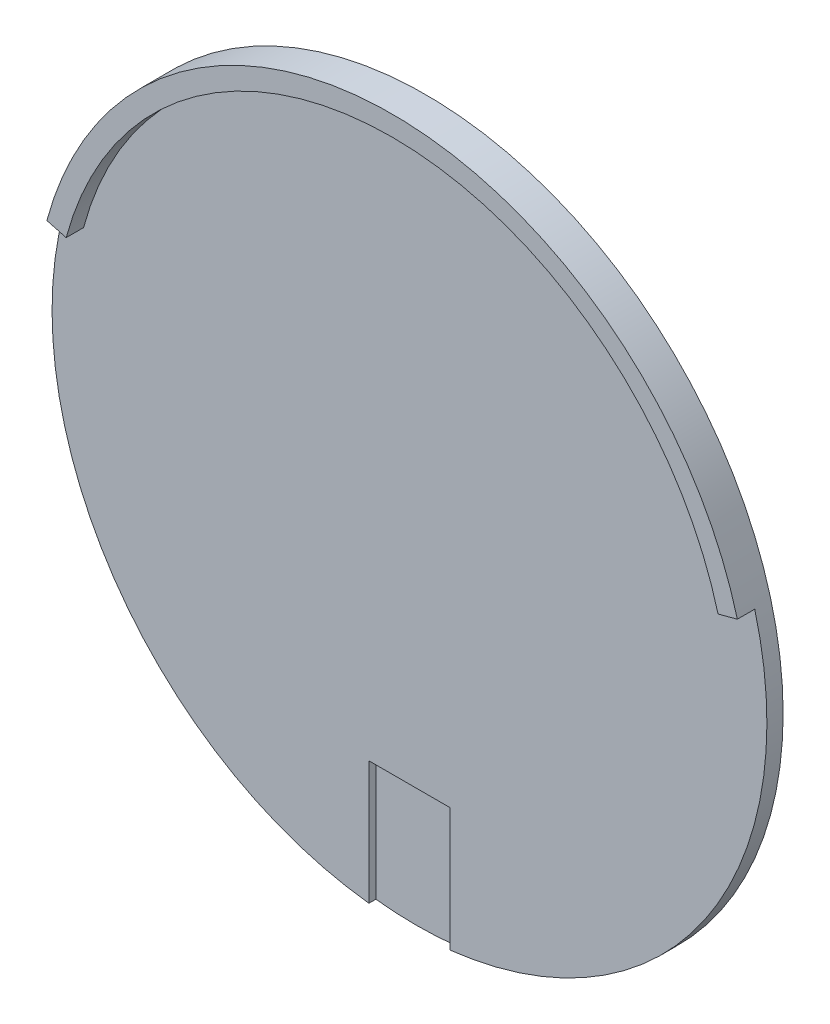
ISO-10303-21;
HEADER;
FILE_DESCRIPTION(('STEP AP214'),'2;1');
FILE_NAME('part.step','',(''),(''),'','','');
FILE_SCHEMA(('AUTOMOTIVE_DESIGN { 1 0 10303 214 1 1 1 1 }'));
ENDSEC;
DATA;
#1=APPLICATION_CONTEXT('core data for automotive mechanical design processes');
#2=APPLICATION_PROTOCOL_DEFINITION('international standard','automotive_design',2000,#1);
#3=PRODUCT_CONTEXT('',#1,'mechanical');
#4=PRODUCT('Part','Part','',(#3));
#5=PRODUCT_RELATED_PRODUCT_CATEGORY('part','',(#4));
#6=PRODUCT_DEFINITION_FORMATION('','',#4);
#7=PRODUCT_DEFINITION_CONTEXT('part definition',#1,'design');
#8=PRODUCT_DEFINITION('design','',#6,#7);
#9=PRODUCT_DEFINITION_SHAPE('','',#8);
#10=(LENGTH_UNIT() NAMED_UNIT(*) SI_UNIT(.MILLI.,.METRE.));
#11=(NAMED_UNIT(*) PLANE_ANGLE_UNIT() SI_UNIT($,.RADIAN.));
#12=(NAMED_UNIT(*) SI_UNIT($,.STERADIAN.) SOLID_ANGLE_UNIT());
#13=UNCERTAINTY_MEASURE_WITH_UNIT(LENGTH_MEASURE(1.E-05),#10,'distance_accuracy_value','');
#14=(GEOMETRIC_REPRESENTATION_CONTEXT(3) GLOBAL_UNCERTAINTY_ASSIGNED_CONTEXT((#13)) GLOBAL_UNIT_ASSIGNED_CONTEXT((#10,
#11,#12)) REPRESENTATION_CONTEXT('',''));
#15=CARTESIAN_POINT('',(0.,0.,0.));
#16=DIRECTION('',(0.,0.,1.));
#17=DIRECTION('',(1.,0.,0.));
#18=AXIS2_PLACEMENT_3D('',#15,#16,#17);
#19=CARTESIAN_POINT('',(70.,0.,74.8));
#20=DIRECTION('',(0.,0.,-1.));
#21=DIRECTION('',(-1.,0.,0.));
#22=AXIS2_PLACEMENT_3D('',#19,#20,#21);
#23=CYLINDRICAL_SURFACE('',#22,61.7);
#24=CARTESIAN_POINT('',(70.,0.,73.6));
#25=DIRECTION('',(0.,0.,1.));
#26=DIRECTION('',(1.,0.,0.));
#27=AXIS2_PLACEMENT_3D('',#24,#25,#26);
#28=CIRCLE('',#27,61.7);
#29=CARTESIAN_POINT('',(63.,-61.3016312996645,73.6));
#30=VERTEX_POINT('',#29);
#31=CARTESIAN_POINT('',(77.,-61.3016312996645,73.6));
#32=VERTEX_POINT('',#31);
#33=EDGE_CURVE('E11',#30,#32,#28,.T.);
#34=ORIENTED_EDGE('',*,*,#33,.F.);
#35=DIRECTION('',(0.,0.,-1.));
#36=VECTOR('',#35,1.);
#37=CARTESIAN_POINT('',(63.,-61.3016312996645,74.8));
#38=LINE('',#37,#36);
#39=CARTESIAN_POINT('',(63.,-61.3016312996645,74.8));
#40=VERTEX_POINT('',#39);
#41=EDGE_CURVE('E134',#30,#40,#38,.F.);
#42=ORIENTED_EDGE('',*,*,#41,.T.);
#43=CARTESIAN_POINT('',(70.,0.,74.8));
#44=DIRECTION('',(0.,0.,1.));
#45=DIRECTION('',(1.,0.,0.));
#46=AXIS2_PLACEMENT_3D('',#43,#44,#45);
#47=CIRCLE('',#46,61.7);
#48=CARTESIAN_POINT('',(10.4023765179645,15.9691350828255,74.8));
#49=VERTEX_POINT('',#48);
#50=EDGE_CURVE('E163',#49,#40,#47,.T.);
#51=ORIENTED_EDGE('',*,*,#50,.F.);
#52=DIRECTION('',(0.,0.,-1.));
#53=VECTOR('',#52,1.);
#54=CARTESIAN_POINT('',(10.4023765179645,15.9691350828255,77.8));
#55=LINE('',#54,#53);
#56=CARTESIAN_POINT('',(10.4023765179645,15.9691350828255,77.8));
#57=VERTEX_POINT('',#56);
#58=EDGE_CURVE('E152',#57,#49,#55,.T.);
#59=ORIENTED_EDGE('',*,*,#58,.F.);
#60=CARTESIAN_POINT('',(70.,0.,77.8));
#61=DIRECTION('',(0.,0.,1.));
#62=DIRECTION('',(1.,0.,0.));
#63=AXIS2_PLACEMENT_3D('',#60,#61,#62);
#64=CIRCLE('',#63,61.7);
#65=CARTESIAN_POINT('',(129.597623482036,15.9691350828255,77.8));
#66=VERTEX_POINT('',#65);
#67=EDGE_CURVE('E142',#66,#57,#64,.T.);
#68=ORIENTED_EDGE('',*,*,#67,.F.);
#69=DIRECTION('',(0.,0.,-1.));
#70=VECTOR('',#69,1.);
#71=CARTESIAN_POINT('',(129.597623482036,15.9691350828255,77.8));
#72=LINE('',#71,#70);
#73=CARTESIAN_POINT('',(129.597623482036,15.9691350828255,74.8));
#74=VERTEX_POINT('',#73);
#75=EDGE_CURVE('E160',#66,#74,#72,.T.);
#76=ORIENTED_EDGE('',*,*,#75,.T.);
#77=CARTESIAN_POINT('',(77.,-61.3016312996645,74.8));
#78=VERTEX_POINT('',#77);
#79=EDGE_CURVE('E170',#78,#74,#47,.T.);
#80=ORIENTED_EDGE('',*,*,#79,.F.);
#81=DIRECTION('',(0.,0.,-1.));
#82=VECTOR('',#81,1.);
#83=CARTESIAN_POINT('',(77.,-61.3016312996645,74.8));
#84=LINE('',#83,#82);
#85=EDGE_CURVE('E56',#78,#32,#84,.T.);
#86=ORIENTED_EDGE('',*,*,#85,.T.);
#87=EDGE_LOOP('',(#34,#42,#51,#59,#68,#76,#80,#86));
#88=FACE_BOUND('',#87,.T.);
#89=CARTESIAN_POINT('',(70.,0.,72.));
#90=DIRECTION('',(0.,0.,1.));
#91=DIRECTION('',(1.,0.,0.));
#92=AXIS2_PLACEMENT_3D('',#89,#90,#91);
#93=CIRCLE('',#92,61.7);
#94=CARTESIAN_POINT('',(131.7,0.,72.));
#95=VERTEX_POINT('',#94);
#96=EDGE_CURVE('E162',#95,#95,#93,.T.);
#97=ORIENTED_EDGE('',*,*,#96,.T.);
#98=EDGE_LOOP('',(#97));
#99=FACE_BOUND('',#98,.T.);
#100=ADVANCED_FACE('F43',(#88,#99),#23,.T.);
#101=CARTESIAN_POINT('',(70.,0.,74.8));
#102=DIRECTION('',(0.,0.,1.));
#103=DIRECTION('',(1.,0.,0.));
#104=AXIS2_PLACEMENT_3D('',#101,#102,#103);
#105=PLANE('',#104);
#106=DIRECTION('',(0.,-1.,0.));
#107=VECTOR('',#106,1.);
#108=CARTESIAN_POINT('',(63.,0.,74.8));
#109=LINE('',#108,#107);
#110=CARTESIAN_POINT('',(63.,-40.,74.8));
#111=VERTEX_POINT('',#110);
#112=EDGE_CURVE('E51',#111,#40,#109,.T.);
#113=ORIENTED_EDGE('',*,*,#112,.F.);
#114=DIRECTION('',(-1.,0.,0.));
#115=VECTOR('',#114,1.);
#116=CARTESIAN_POINT('',(70.,-40.,74.8));
#117=LINE('',#116,#115);
#118=CARTESIAN_POINT('',(77.,-40.,74.8));
#119=VERTEX_POINT('',#118);
#120=EDGE_CURVE('E172',#119,#111,#117,.T.);
#121=ORIENTED_EDGE('',*,*,#120,.F.);
#122=DIRECTION('',(0.,1.,0.));
#123=VECTOR('',#122,1.);
#124=CARTESIAN_POINT('',(77.,0.,74.8));
#125=LINE('',#124,#123);
#126=EDGE_CURVE('E118',#78,#119,#125,.T.);
#127=ORIENTED_EDGE('',*,*,#126,.F.);
#128=ORIENTED_EDGE('',*,*,#79,.T.);
#129=DIRECTION('',(0.965925826289068,0.258819045102522,0.));
#130=VECTOR('',#129,1.);
#131=CARTESIAN_POINT('',(126.265179381338,15.0762093772218,74.8));
#132=LINE('',#131,#130);
#133=CARTESIAN_POINT('',(126.265179381338,15.0762093772218,74.8));
#134=VERTEX_POINT('',#133);
#135=EDGE_CURVE('E146',#134,#74,#132,.T.);
#136=ORIENTED_EDGE('',*,*,#135,.F.);
#137=CARTESIAN_POINT('',(70.,0.,74.8));
#138=DIRECTION('',(0.,0.,-1.));
#139=DIRECTION('',(-1.,0.,0.));
#140=AXIS2_PLACEMENT_3D('',#137,#138,#139);
#141=CIRCLE('',#140,58.25);
#142=CARTESIAN_POINT('',(13.7348206186618,15.0762093772218,74.8));
#143=VERTEX_POINT('',#142);
#144=EDGE_CURVE('E67',#143,#134,#141,.T.);
#145=ORIENTED_EDGE('',*,*,#144,.F.);
#146=DIRECTION('',(0.965925826289068,-0.258819045102521,0.));
#147=VECTOR('',#146,1.);
#148=CARTESIAN_POINT('',(10.4023765179645,15.9691350828255,74.8));
#149=LINE('',#148,#147);
#150=EDGE_CURVE('E140',#49,#143,#149,.T.);
#151=ORIENTED_EDGE('',*,*,#150,.F.);
#152=ORIENTED_EDGE('',*,*,#50,.T.);
#153=EDGE_LOOP('',(#113,#121,#127,#128,#136,#145,#151,#152));
#154=FACE_BOUND('',#153,.T.);
#155=ADVANCED_FACE('F206',(#154),#105,.T.);
#156=CARTESIAN_POINT('',(70.,0.,72.));
#157=DIRECTION('',(0.,0.,1.));
#158=DIRECTION('',(1.,0.,0.));
#159=AXIS2_PLACEMENT_3D('',#156,#157,#158);
#160=PLANE('',#159);
#161=CARTESIAN_POINT('',(70.,50.,72.));
#162=DIRECTION('',(0.,0.,1.));
#163=DIRECTION('',(1.,0.,0.));
#164=AXIS2_PLACEMENT_3D('',#161,#162,#163);
#165=CIRCLE('',#164,1.);
#166=CARTESIAN_POINT('',(71.,50.,72.));
#167=VERTEX_POINT('',#166);
#168=EDGE_CURVE('E46',#167,#167,#165,.T.);
#169=ORIENTED_EDGE('',*,*,#168,.T.);
#170=EDGE_LOOP('',(#169));
#171=FACE_BOUND('',#170,.T.);
#172=CARTESIAN_POINT('',(26.6987298107781,-25.,72.));
#173=DIRECTION('',(0.,0.,1.));
#174=DIRECTION('',(1.,0.,0.));
#175=AXIS2_PLACEMENT_3D('',#172,#173,#174);
#176=CIRCLE('',#175,1.);
#177=CARTESIAN_POINT('',(27.6987298107781,-25.,72.));
#178=VERTEX_POINT('',#177);
#179=EDGE_CURVE('E176',#178,#178,#176,.T.);
#180=ORIENTED_EDGE('',*,*,#179,.T.);
#181=EDGE_LOOP('',(#180));
#182=FACE_BOUND('',#181,.T.);
#183=CARTESIAN_POINT('',(113.301270189222,-25.,72.));
#184=DIRECTION('',(0.,0.,1.));
#185=DIRECTION('',(1.,0.,0.));
#186=AXIS2_PLACEMENT_3D('',#183,#184,#185);
#187=CIRCLE('',#186,1.);
#188=CARTESIAN_POINT('',(114.301270189222,-25.,72.));
#189=VERTEX_POINT('',#188);
#190=EDGE_CURVE('E171',#189,#189,#187,.T.);
#191=ORIENTED_EDGE('',*,*,#190,.T.);
#192=EDGE_LOOP('',(#191));
#193=FACE_BOUND('',#192,.T.);
#194=ORIENTED_EDGE('',*,*,#96,.F.);
#195=EDGE_LOOP('',(#194));
#196=FACE_BOUND('',#195,.T.);
#197=ADVANCED_FACE('F215',(#171,#182,#193,#196),#160,.F.);
#198=CARTESIAN_POINT('',(70.,0.,77.8));
#199=DIRECTION('',(0.,0.,-1.));
#200=DIRECTION('',(-1.,0.,0.));
#201=AXIS2_PLACEMENT_3D('',#198,#199,#200);
#202=CYLINDRICAL_SURFACE('',#201,58.25);
#203=ORIENTED_EDGE('',*,*,#144,.T.);
#204=DIRECTION('',(0.,0.,-1.));
#205=VECTOR('',#204,1.);
#206=CARTESIAN_POINT('',(126.265179381338,15.0762093772218,77.8));
#207=LINE('',#206,#205);
#208=CARTESIAN_POINT('',(126.265179381338,15.0762093772218,77.8));
#209=VERTEX_POINT('',#208);
#210=EDGE_CURVE('E159',#209,#134,#207,.T.);
#211=ORIENTED_EDGE('',*,*,#210,.F.);
#212=CARTESIAN_POINT('',(70.,0.,77.8));
#213=DIRECTION('',(0.,0.,-1.));
#214=DIRECTION('',(-1.,0.,0.));
#215=AXIS2_PLACEMENT_3D('',#212,#213,#214);
#216=CIRCLE('',#215,58.25);
#217=CARTESIAN_POINT('',(13.7348206186618,15.0762093772218,77.8));
#218=VERTEX_POINT('',#217);
#219=EDGE_CURVE('E136',#218,#209,#216,.T.);
#220=ORIENTED_EDGE('',*,*,#219,.F.);
#221=DIRECTION('',(0.,0.,-1.));
#222=VECTOR('',#221,1.);
#223=CARTESIAN_POINT('',(13.7348206186618,15.0762093772218,77.8));
#224=LINE('',#223,#222);
#225=EDGE_CURVE('E148',#218,#143,#224,.T.);
#226=ORIENTED_EDGE('',*,*,#225,.T.);
#227=EDGE_LOOP('',(#203,#211,#220,#226));
#228=FACE_BOUND('',#227,.T.);
#229=ADVANCED_FACE('F217',(#228),#202,.F.);
#230=CARTESIAN_POINT('',(126.265179381338,15.0762093772218,77.8));
#231=DIRECTION('',(-0.258819045102522,0.965925826289068,0.));
#232=DIRECTION('',(-0.965925826289068,-0.258819045102522,0.));
#233=AXIS2_PLACEMENT_3D('',#230,#231,#232);
#234=PLANE('',#233);
#235=ORIENTED_EDGE('',*,*,#135,.T.);
#236=ORIENTED_EDGE('',*,*,#75,.F.);
#237=DIRECTION('',(0.965925826289068,0.258819045102522,0.));
#238=VECTOR('',#237,1.);
#239=CARTESIAN_POINT('',(126.265179381338,15.0762093772218,77.8));
#240=LINE('',#239,#238);
#241=EDGE_CURVE('E138',#209,#66,#240,.T.);
#242=ORIENTED_EDGE('',*,*,#241,.F.);
#243=ORIENTED_EDGE('',*,*,#210,.T.);
#244=EDGE_LOOP('',(#235,#236,#242,#243));
#245=FACE_BOUND('',#244,.T.);
#246=ADVANCED_FACE('F221',(#245),#234,.F.);
#247=CARTESIAN_POINT('',(10.4023765179645,15.9691350828255,77.8));
#248=DIRECTION('',(0.258819045102521,0.965925826289068,0.));
#249=DIRECTION('',(-0.965925826289068,0.258819045102521,0.));
#250=AXIS2_PLACEMENT_3D('',#247,#248,#249);
#251=PLANE('',#250);
#252=ORIENTED_EDGE('',*,*,#150,.T.);
#253=ORIENTED_EDGE('',*,*,#225,.F.);
#254=DIRECTION('',(0.965925826289068,-0.258819045102521,0.));
#255=VECTOR('',#254,1.);
#256=CARTESIAN_POINT('',(10.4023765179645,15.9691350828255,77.8));
#257=LINE('',#256,#255);
#258=EDGE_CURVE('E145',#57,#218,#257,.T.);
#259=ORIENTED_EDGE('',*,*,#258,.F.);
#260=ORIENTED_EDGE('',*,*,#58,.T.);
#261=EDGE_LOOP('',(#252,#253,#259,#260));
#262=FACE_BOUND('',#261,.T.);
#263=ADVANCED_FACE('F228',(#262),#251,.F.);
#264=CARTESIAN_POINT('',(70.,0.,77.8));
#265=DIRECTION('',(0.,0.,-1.));
#266=DIRECTION('',(-1.,0.,0.));
#267=AXIS2_PLACEMENT_3D('',#264,#265,#266);
#268=PLANE('',#267);
#269=ORIENTED_EDGE('',*,*,#219,.T.);
#270=ORIENTED_EDGE('',*,*,#241,.T.);
#271=ORIENTED_EDGE('',*,*,#67,.T.);
#272=ORIENTED_EDGE('',*,*,#258,.T.);
#273=EDGE_LOOP('',(#269,#270,#271,#272));
#274=FACE_BOUND('',#273,.T.);
#275=ADVANCED_FACE('F233',(#274),#268,.F.);
#276=CARTESIAN_POINT('',(0.,0.,73.6));
#277=DIRECTION('',(0.,0.,1.));
#278=DIRECTION('',(1.,0.,0.));
#279=AXIS2_PLACEMENT_3D('',#276,#277,#278);
#280=PLANE('',#279);
#281=ORIENTED_EDGE('',*,*,#33,.T.);
#282=DIRECTION('',(0.,1.,0.));
#283=VECTOR('',#282,1.);
#284=CARTESIAN_POINT('',(77.,-63.,73.6));
#285=LINE('',#284,#283);
#286=CARTESIAN_POINT('',(77.,-40.,73.6));
#287=VERTEX_POINT('',#286);
#288=EDGE_CURVE('E107',#32,#287,#285,.T.);
#289=ORIENTED_EDGE('',*,*,#288,.T.);
#290=DIRECTION('',(-1.,0.,0.));
#291=VECTOR('',#290,1.);
#292=CARTESIAN_POINT('',(77.,-40.,73.6));
#293=LINE('',#292,#291);
#294=CARTESIAN_POINT('',(63.,-40.,73.6));
#295=VERTEX_POINT('',#294);
#296=EDGE_CURVE('E114',#287,#295,#293,.T.);
#297=ORIENTED_EDGE('',*,*,#296,.T.);
#298=DIRECTION('',(0.,-1.,0.));
#299=VECTOR('',#298,1.);
#300=CARTESIAN_POINT('',(63.,-40.,73.6));
#301=LINE('',#300,#299);
#302=EDGE_CURVE('E113',#295,#30,#301,.T.);
#303=ORIENTED_EDGE('',*,*,#302,.T.);
#304=EDGE_LOOP('',(#281,#289,#297,#303));
#305=FACE_BOUND('',#304,.T.);
#306=ADVANCED_FACE('F109',(#305),#280,.T.);
#307=CARTESIAN_POINT('',(63.,-40.,73.6));
#308=DIRECTION('',(-1.,0.,0.));
#309=DIRECTION('',(0.,0.,1.));
#310=AXIS2_PLACEMENT_3D('',#307,#308,#309);
#311=PLANE('',#310);
#312=ORIENTED_EDGE('',*,*,#302,.F.);
#313=DIRECTION('',(0.,0.,1.));
#314=VECTOR('',#313,1.);
#315=CARTESIAN_POINT('',(63.,-40.,73.6));
#316=LINE('',#315,#314);
#317=EDGE_CURVE('E124',#295,#111,#316,.T.);
#318=ORIENTED_EDGE('',*,*,#317,.T.);
#319=ORIENTED_EDGE('',*,*,#112,.T.);
#320=ORIENTED_EDGE('',*,*,#41,.F.);
#321=EDGE_LOOP('',(#312,#318,#319,#320));
#322=FACE_BOUND('',#321,.T.);
#323=ADVANCED_FACE('F236',(#322),#311,.F.);
#324=CARTESIAN_POINT('',(77.,-63.,73.6));
#325=DIRECTION('',(1.,0.,0.));
#326=DIRECTION('',(0.,0.,-1.));
#327=AXIS2_PLACEMENT_3D('',#324,#325,#326);
#328=PLANE('',#327);
#329=ORIENTED_EDGE('',*,*,#126,.T.);
#330=DIRECTION('',(0.,0.,1.));
#331=VECTOR('',#330,1.);
#332=CARTESIAN_POINT('',(77.,-40.,73.6));
#333=LINE('',#332,#331);
#334=EDGE_CURVE('E119',#287,#119,#333,.T.);
#335=ORIENTED_EDGE('',*,*,#334,.F.);
#336=ORIENTED_EDGE('',*,*,#288,.F.);
#337=ORIENTED_EDGE('',*,*,#85,.F.);
#338=EDGE_LOOP('',(#329,#335,#336,#337));
#339=FACE_BOUND('',#338,.T.);
#340=ADVANCED_FACE('F116',(#339),#328,.F.);
#341=CARTESIAN_POINT('',(77.,-40.,73.6));
#342=DIRECTION('',(0.,1.,0.));
#343=DIRECTION('',(0.,0.,1.));
#344=AXIS2_PLACEMENT_3D('',#341,#342,#343);
#345=PLANE('',#344);
#346=ORIENTED_EDGE('',*,*,#120,.T.);
#347=ORIENTED_EDGE('',*,*,#317,.F.);
#348=ORIENTED_EDGE('',*,*,#296,.F.);
#349=ORIENTED_EDGE('',*,*,#334,.T.);
#350=EDGE_LOOP('',(#346,#347,#348,#349));
#351=FACE_BOUND('',#350,.T.);
#352=ADVANCED_FACE('F125',(#351),#345,.F.);
#353=CARTESIAN_POINT('',(113.301270189222,-25.,71.5));
#354=DIRECTION('',(0.,0.,1.));
#355=DIRECTION('',(1.,0.,0.));
#356=AXIS2_PLACEMENT_3D('',#353,#354,#355);
#357=CYLINDRICAL_SURFACE('',#356,1.);
#358=CARTESIAN_POINT('',(113.301270189222,-25.,74.));
#359=DIRECTION('',(0.,0.,1.));
#360=DIRECTION('',(1.,0.,0.));
#361=AXIS2_PLACEMENT_3D('',#358,#359,#360);
#362=CIRCLE('',#361,1.);
#363=CARTESIAN_POINT('',(114.301270189222,-25.,74.));
#364=VERTEX_POINT('',#363);
#365=EDGE_CURVE('E183',#364,#364,#362,.T.);
#366=ORIENTED_EDGE('',*,*,#365,.T.);
#367=EDGE_LOOP('',(#366));
#368=FACE_BOUND('',#367,.T.);
#369=ORIENTED_EDGE('',*,*,#190,.F.);
#370=EDGE_LOOP('',(#369));
#371=FACE_BOUND('',#370,.T.);
#372=ADVANCED_FACE('F243',(#368,#371),#357,.F.);
#373=CARTESIAN_POINT('',(113.301270189222,-25.,74.));
#374=DIRECTION('',(0.,0.,1.));
#375=DIRECTION('',(1.,0.,0.));
#376=AXIS2_PLACEMENT_3D('',#373,#374,#375);
#377=PLANE('',#376);
#378=ORIENTED_EDGE('',*,*,#365,.F.);
#379=EDGE_LOOP('',(#378));
#380=FACE_BOUND('',#379,.T.);
#381=ADVANCED_FACE('F249',(#380),#377,.F.);
#382=CARTESIAN_POINT('',(26.6987298107781,-25.,71.5));
#383=DIRECTION('',(0.,0.,1.));
#384=DIRECTION('',(1.,0.,0.));
#385=AXIS2_PLACEMENT_3D('',#382,#383,#384);
#386=CYLINDRICAL_SURFACE('',#385,1.);
#387=CARTESIAN_POINT('',(26.6987298107781,-25.,74.));
#388=DIRECTION('',(0.,0.,1.));
#389=DIRECTION('',(1.,0.,0.));
#390=AXIS2_PLACEMENT_3D('',#387,#388,#389);
#391=CIRCLE('',#390,1.);
#392=CARTESIAN_POINT('',(27.6987298107781,-25.,74.));
#393=VERTEX_POINT('',#392);
#394=EDGE_CURVE('E189',#393,#393,#391,.T.);
#395=ORIENTED_EDGE('',*,*,#394,.T.);
#396=EDGE_LOOP('',(#395));
#397=FACE_BOUND('',#396,.T.);
#398=ORIENTED_EDGE('',*,*,#179,.F.);
#399=EDGE_LOOP('',(#398));
#400=FACE_BOUND('',#399,.T.);
#401=ADVANCED_FACE('F253',(#397,#400),#386,.F.);
#402=CARTESIAN_POINT('',(26.6987298107781,-25.,74.));
#403=DIRECTION('',(0.,0.,1.));
#404=DIRECTION('',(1.,0.,0.));
#405=AXIS2_PLACEMENT_3D('',#402,#403,#404);
#406=PLANE('',#405);
#407=ORIENTED_EDGE('',*,*,#394,.F.);
#408=EDGE_LOOP('',(#407));
#409=FACE_BOUND('',#408,.T.);
#410=ADVANCED_FACE('F201',(#409),#406,.F.);
#411=CARTESIAN_POINT('',(70.,50.,71.5));
#412=DIRECTION('',(0.,0.,1.));
#413=DIRECTION('',(1.,0.,0.));
#414=AXIS2_PLACEMENT_3D('',#411,#412,#413);
#415=CYLINDRICAL_SURFACE('',#414,1.);
#416=CARTESIAN_POINT('',(70.,50.,74.));
#417=DIRECTION('',(0.,0.,1.));
#418=DIRECTION('',(1.,0.,0.));
#419=AXIS2_PLACEMENT_3D('',#416,#417,#418);
#420=CIRCLE('',#419,1.);
#421=CARTESIAN_POINT('',(71.,50.,74.));
#422=VERTEX_POINT('',#421);
#423=EDGE_CURVE('E177',#422,#422,#420,.T.);
#424=ORIENTED_EDGE('',*,*,#423,.T.);
#425=EDGE_LOOP('',(#424));
#426=FACE_BOUND('',#425,.T.);
#427=ORIENTED_EDGE('',*,*,#168,.F.);
#428=EDGE_LOOP('',(#427));
#429=FACE_BOUND('',#428,.T.);
#430=ADVANCED_FACE('F193',(#426,#429),#415,.F.);
#431=CARTESIAN_POINT('',(70.,50.,74.));
#432=DIRECTION('',(0.,0.,1.));
#433=DIRECTION('',(1.,0.,0.));
#434=AXIS2_PLACEMENT_3D('',#431,#432,#433);
#435=PLANE('',#434);
#436=ORIENTED_EDGE('',*,*,#423,.F.);
#437=EDGE_LOOP('',(#436));
#438=FACE_BOUND('',#437,.T.);
#439=ADVANCED_FACE('F197',(#438),#435,.F.);
#440=CLOSED_SHELL('',(#100,#155,#197,#229,#246,#263,#275,#306,#323,#340,#352,#372,#381,#401,
#410,#430,#439));
#441=MANIFOLD_SOLID_BREP('B2',#440);
#442=ADVANCED_BREP_SHAPE_REPRESENTATION('',(#18,#441),#14);
#443=SHAPE_DEFINITION_REPRESENTATION(#9,#442);
ENDSEC;
END-ISO-10303-21;
